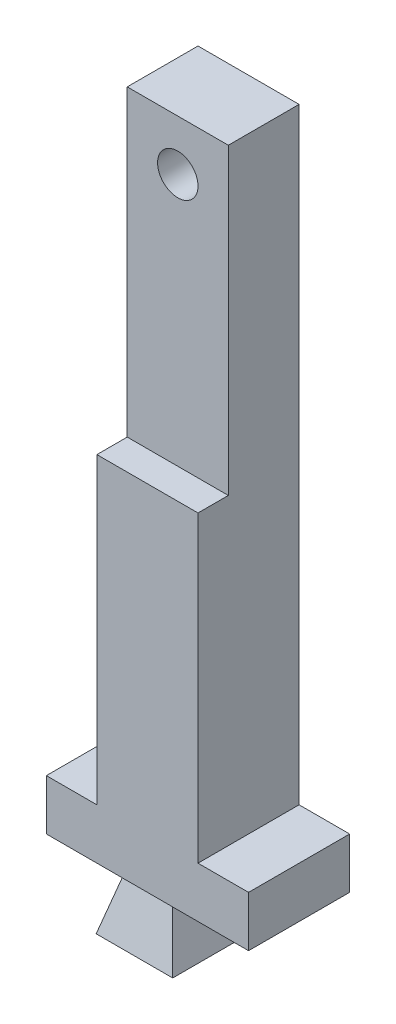
ISO-10303-21;
HEADER;
FILE_DESCRIPTION(('STEP AP214'),'2;1');
FILE_NAME('part.step','',(''),(''),'','','');
FILE_SCHEMA(('AUTOMOTIVE_DESIGN { 1 0 10303 214 1 1 1 1 }'));
ENDSEC;
DATA;
#1=APPLICATION_CONTEXT('core data for automotive mechanical design processes');
#2=APPLICATION_PROTOCOL_DEFINITION('international standard','automotive_design',2000,#1);
#3=PRODUCT_CONTEXT('',#1,'mechanical');
#4=PRODUCT('Part','Part','',(#3));
#5=PRODUCT_RELATED_PRODUCT_CATEGORY('part','',(#4));
#6=PRODUCT_DEFINITION_FORMATION('','',#4);
#7=PRODUCT_DEFINITION_CONTEXT('part definition',#1,'design');
#8=PRODUCT_DEFINITION('design','',#6,#7);
#9=PRODUCT_DEFINITION_SHAPE('','',#8);
#10=(LENGTH_UNIT() NAMED_UNIT(*) SI_UNIT(.MILLI.,.METRE.));
#11=(NAMED_UNIT(*) PLANE_ANGLE_UNIT() SI_UNIT($,.RADIAN.));
#12=(NAMED_UNIT(*) SI_UNIT($,.STERADIAN.) SOLID_ANGLE_UNIT());
#13=UNCERTAINTY_MEASURE_WITH_UNIT(LENGTH_MEASURE(1.E-05),#10,'distance_accuracy_value','');
#14=(GEOMETRIC_REPRESENTATION_CONTEXT(3) GLOBAL_UNCERTAINTY_ASSIGNED_CONTEXT((#13)) GLOBAL_UNIT_ASSIGNED_CONTEXT((#10,
#11,#12)) REPRESENTATION_CONTEXT('',''));
#15=CARTESIAN_POINT('',(0.,0.,0.));
#16=DIRECTION('',(0.,0.,1.));
#17=DIRECTION('',(1.,0.,0.));
#18=AXIS2_PLACEMENT_3D('',#15,#16,#17);
#19=CARTESIAN_POINT('',(0.,44.45,12.7));
#20=DIRECTION('',(0.,-1.,0.));
#21=DIRECTION('',(0.,0.,-1.));
#22=AXIS2_PLACEMENT_3D('',#19,#20,#21);
#23=PLANE('',#22);
#24=DIRECTION('',(1.,0.,0.));
#25=VECTOR('',#24,1.);
#26=CARTESIAN_POINT('',(0.,44.45,8.89));
#27=LINE('',#26,#25);
#28=CARTESIAN_POINT('',(0.,44.45,8.89));
#29=VERTEX_POINT('',#28);
#30=CARTESIAN_POINT('',(12.7,44.45,8.89));
#31=VERTEX_POINT('',#30);
#32=EDGE_CURVE('E150',#29,#31,#27,.T.);
#33=ORIENTED_EDGE('',*,*,#32,.F.);
#34=DIRECTION('',(0.,0.,-1.));
#35=VECTOR('',#34,1.);
#36=CARTESIAN_POINT('',(0.,44.45,12.7));
#37=LINE('',#36,#35);
#38=CARTESIAN_POINT('',(0.,44.45,12.7));
#39=VERTEX_POINT('',#38);
#40=EDGE_CURVE('E164',#39,#29,#37,.T.);
#41=ORIENTED_EDGE('',*,*,#40,.F.);
#42=DIRECTION('',(-1.,0.,0.));
#43=VECTOR('',#42,1.);
#44=CARTESIAN_POINT('',(0.,44.45,12.7));
#45=LINE('',#44,#43);
#46=CARTESIAN_POINT('',(12.7,44.45,12.7));
#47=VERTEX_POINT('',#46);
#48=EDGE_CURVE('E257',#47,#39,#45,.T.);
#49=ORIENTED_EDGE('',*,*,#48,.F.);
#50=DIRECTION('',(0.,0.,-1.));
#51=VECTOR('',#50,1.);
#52=CARTESIAN_POINT('',(12.7,44.45,12.7));
#53=LINE('',#52,#51);
#54=EDGE_CURVE('E167',#47,#31,#53,.T.);
#55=ORIENTED_EDGE('',*,*,#54,.T.);
#56=EDGE_LOOP('',(#33,#41,#49,#55));
#57=FACE_BOUND('',#56,.T.);
#58=ADVANCED_FACE('F43',(#57),#23,.F.);
#59=CARTESIAN_POINT('',(12.7,0.,12.7));
#60=DIRECTION('',(0.,1.,0.));
#61=DIRECTION('',(0.,0.,1.));
#62=AXIS2_PLACEMENT_3D('',#59,#60,#61);
#63=PLANE('',#62);
#64=DIRECTION('',(0.,0.,1.));
#65=VECTOR('',#64,1.);
#66=CARTESIAN_POINT('',(9.525,0.,0.));
#67=LINE('',#66,#65);
#68=CARTESIAN_POINT('',(9.525,0.,0.));
#69=VERTEX_POINT('',#68);
#70=CARTESIAN_POINT('',(9.525,0.,12.7));
#71=VERTEX_POINT('',#70);
#72=EDGE_CURVE('E296',#69,#71,#67,.T.);
#73=ORIENTED_EDGE('',*,*,#72,.F.);
#74=DIRECTION('',(1.,0.,0.));
#75=VECTOR('',#74,1.);
#76=CARTESIAN_POINT('',(12.7,0.,0.));
#77=LINE('',#76,#75);
#78=CARTESIAN_POINT('',(19.05,0.,0.));
#79=VERTEX_POINT('',#78);
#80=EDGE_CURVE('E246',#69,#79,#77,.T.);
#81=ORIENTED_EDGE('',*,*,#80,.T.);
#82=DIRECTION('',(0.,0.,-1.));
#83=VECTOR('',#82,1.);
#84=CARTESIAN_POINT('',(19.05,0.,12.7));
#85=LINE('',#84,#83);
#86=CARTESIAN_POINT('',(19.05,0.,12.7));
#87=VERTEX_POINT('',#86);
#88=EDGE_CURVE('E11',#87,#79,#85,.T.);
#89=ORIENTED_EDGE('',*,*,#88,.F.);
#90=DIRECTION('',(1.,0.,0.));
#91=VECTOR('',#90,1.);
#92=CARTESIAN_POINT('',(0.,0.,12.7));
#93=LINE('',#92,#91);
#94=EDGE_CURVE('E59',#71,#87,#93,.T.);
#95=ORIENTED_EDGE('',*,*,#94,.F.);
#96=EDGE_LOOP('',(#73,#81,#89,#95));
#97=FACE_BOUND('',#96,.T.);
#98=ADVANCED_FACE('F45',(#97),#63,.F.);
#99=DIRECTION('',(0.,0.,-1.));
#100=VECTOR('',#99,1.);
#101=CARTESIAN_POINT('',(3.175,0.,0.));
#102=LINE('',#101,#100);
#103=CARTESIAN_POINT('',(3.175,0.,12.7));
#104=VERTEX_POINT('',#103);
#105=CARTESIAN_POINT('',(3.175,0.,0.));
#106=VERTEX_POINT('',#105);
#107=EDGE_CURVE('E67',#104,#106,#102,.T.);
#108=ORIENTED_EDGE('',*,*,#107,.F.);
#109=CARTESIAN_POINT('',(-6.35,0.,12.7));
#110=VERTEX_POINT('',#109);
#111=EDGE_CURVE('E268',#110,#104,#93,.T.);
#112=ORIENTED_EDGE('',*,*,#111,.F.);
#113=DIRECTION('',(0.,0.,-1.));
#114=VECTOR('',#113,1.);
#115=CARTESIAN_POINT('',(-6.35,0.,12.7));
#116=LINE('',#115,#114);
#117=CARTESIAN_POINT('',(-6.35,0.,0.));
#118=VERTEX_POINT('',#117);
#119=EDGE_CURVE('E227',#110,#118,#116,.T.);
#120=ORIENTED_EDGE('',*,*,#119,.T.);
#121=EDGE_CURVE('E214',#118,#106,#77,.T.);
#122=ORIENTED_EDGE('',*,*,#121,.T.);
#123=EDGE_LOOP('',(#108,#112,#120,#122));
#124=FACE_BOUND('',#123,.T.);
#125=ADVANCED_FACE('F355',(#124),#63,.F.);
#126=CARTESIAN_POINT('',(19.05,0.,12.7));
#127=DIRECTION('',(-1.,0.,0.));
#128=DIRECTION('',(0.,0.,1.));
#129=AXIS2_PLACEMENT_3D('',#126,#127,#128);
#130=PLANE('',#129);
#131=DIRECTION('',(0.,1.,0.));
#132=VECTOR('',#131,1.);
#133=CARTESIAN_POINT('',(19.05,0.,0.));
#134=LINE('',#133,#132);
#135=CARTESIAN_POINT('',(19.05,6.35,0.));
#136=VERTEX_POINT('',#135);
#137=EDGE_CURVE('E205',#79,#136,#134,.T.);
#138=ORIENTED_EDGE('',*,*,#137,.T.);
#139=DIRECTION('',(0.,0.,-1.));
#140=VECTOR('',#139,1.);
#141=CARTESIAN_POINT('',(19.05,6.35,12.7));
#142=LINE('',#141,#140);
#143=CARTESIAN_POINT('',(19.05,6.35,12.7));
#144=VERTEX_POINT('',#143);
#145=EDGE_CURVE('E52',#144,#136,#142,.T.);
#146=ORIENTED_EDGE('',*,*,#145,.F.);
#147=DIRECTION('',(0.,1.,0.));
#148=VECTOR('',#147,1.);
#149=CARTESIAN_POINT('',(19.05,0.,12.7));
#150=LINE('',#149,#148);
#151=EDGE_CURVE('E265',#87,#144,#150,.T.);
#152=ORIENTED_EDGE('',*,*,#151,.F.);
#153=ORIENTED_EDGE('',*,*,#88,.T.);
#154=EDGE_LOOP('',(#138,#146,#152,#153));
#155=FACE_BOUND('',#154,.T.);
#156=ADVANCED_FACE('F364',(#155),#130,.F.);
#157=CARTESIAN_POINT('',(19.05,6.35,12.7));
#158=DIRECTION('',(0.,-1.,0.));
#159=DIRECTION('',(1.,0.,0.));
#160=AXIS2_PLACEMENT_3D('',#157,#158,#159);
#161=PLANE('',#160);
#162=DIRECTION('',(-1.,0.,0.));
#163=VECTOR('',#162,1.);
#164=CARTESIAN_POINT('',(19.05,6.35,0.));
#165=LINE('',#164,#163);
#166=CARTESIAN_POINT('',(12.7,6.35,0.));
#167=VERTEX_POINT('',#166);
#168=EDGE_CURVE('E196',#136,#167,#165,.T.);
#169=ORIENTED_EDGE('',*,*,#168,.T.);
#170=DIRECTION('',(0.,0.,-1.));
#171=VECTOR('',#170,1.);
#172=CARTESIAN_POINT('',(12.7,6.35,12.7));
#173=LINE('',#172,#171);
#174=CARTESIAN_POINT('',(12.7,6.35,12.7));
#175=VERTEX_POINT('',#174);
#176=EDGE_CURVE('E179',#175,#167,#173,.T.);
#177=ORIENTED_EDGE('',*,*,#176,.F.);
#178=DIRECTION('',(-1.,0.,0.));
#179=VECTOR('',#178,1.);
#180=CARTESIAN_POINT('',(19.05,6.35,12.7));
#181=LINE('',#180,#179);
#182=EDGE_CURVE('E197',#144,#175,#181,.T.);
#183=ORIENTED_EDGE('',*,*,#182,.F.);
#184=ORIENTED_EDGE('',*,*,#145,.T.);
#185=EDGE_LOOP('',(#169,#177,#183,#184));
#186=FACE_BOUND('',#185,.T.);
#187=ADVANCED_FACE('F194',(#186),#161,.F.);
#188=CARTESIAN_POINT('',(12.7,6.35,12.7));
#189=DIRECTION('',(-1.,0.,0.));
#190=DIRECTION('',(0.,0.,1.));
#191=AXIS2_PLACEMENT_3D('',#188,#189,#190);
#192=PLANE('',#191);
#193=DIRECTION('',(0.,1.,0.));
#194=VECTOR('',#193,1.);
#195=CARTESIAN_POINT('',(12.7,6.35,0.));
#196=LINE('',#195,#194);
#197=CARTESIAN_POINT('',(12.7,82.55,0.));
#198=VERTEX_POINT('',#197);
#199=EDGE_CURVE('E207',#167,#198,#196,.T.);
#200=ORIENTED_EDGE('',*,*,#199,.T.);
#201=DIRECTION('',(0.,0.,-1.));
#202=VECTOR('',#201,1.);
#203=CARTESIAN_POINT('',(12.7,82.55,0.));
#204=LINE('',#203,#202);
#205=CARTESIAN_POINT('',(12.7,82.55,8.89));
#206=VERTEX_POINT('',#205);
#207=EDGE_CURVE('E274',#206,#198,#204,.T.);
#208=ORIENTED_EDGE('',*,*,#207,.F.);
#209=DIRECTION('',(0.,1.,0.));
#210=VECTOR('',#209,1.);
#211=CARTESIAN_POINT('',(12.7,44.45,8.89));
#212=LINE('',#211,#210);
#213=EDGE_CURVE('E169',#31,#206,#212,.T.);
#214=ORIENTED_EDGE('',*,*,#213,.F.);
#215=ORIENTED_EDGE('',*,*,#54,.F.);
#216=DIRECTION('',(0.,1.,0.));
#217=VECTOR('',#216,1.);
#218=CARTESIAN_POINT('',(12.7,6.35,12.7));
#219=LINE('',#218,#217);
#220=EDGE_CURVE('E260',#175,#47,#219,.T.);
#221=ORIENTED_EDGE('',*,*,#220,.F.);
#222=ORIENTED_EDGE('',*,*,#176,.T.);
#223=EDGE_LOOP('',(#200,#208,#214,#215,#221,#222));
#224=FACE_BOUND('',#223,.T.);
#225=ADVANCED_FACE('F359',(#224),#192,.F.);
#226=CARTESIAN_POINT('',(0.,6.35,12.7));
#227=DIRECTION('',(1.,0.,0.));
#228=DIRECTION('',(0.,0.,-1.));
#229=AXIS2_PLACEMENT_3D('',#226,#227,#228);
#230=PLANE('',#229);
#231=DIRECTION('',(0.,-1.,0.));
#232=VECTOR('',#231,1.);
#233=CARTESIAN_POINT('',(0.,6.35,0.));
#234=LINE('',#233,#232);
#235=CARTESIAN_POINT('',(0.,82.55,0.));
#236=VERTEX_POINT('',#235);
#237=CARTESIAN_POINT('',(0.,6.35,0.));
#238=VERTEX_POINT('',#237);
#239=EDGE_CURVE('E212',#236,#238,#234,.T.);
#240=ORIENTED_EDGE('',*,*,#239,.T.);
#241=DIRECTION('',(0.,0.,-1.));
#242=VECTOR('',#241,1.);
#243=CARTESIAN_POINT('',(0.,6.35,12.7));
#244=LINE('',#243,#242);
#245=CARTESIAN_POINT('',(0.,6.35,12.7));
#246=VERTEX_POINT('',#245);
#247=EDGE_CURVE('E175',#246,#238,#244,.T.);
#248=ORIENTED_EDGE('',*,*,#247,.F.);
#249=DIRECTION('',(0.,-1.,0.));
#250=VECTOR('',#249,1.);
#251=CARTESIAN_POINT('',(0.,6.35,12.7));
#252=LINE('',#251,#250);
#253=EDGE_CURVE('E173',#39,#246,#252,.T.);
#254=ORIENTED_EDGE('',*,*,#253,.F.);
#255=ORIENTED_EDGE('',*,*,#40,.T.);
#256=DIRECTION('',(0.,-1.,0.));
#257=VECTOR('',#256,1.);
#258=CARTESIAN_POINT('',(0.,44.45,8.89));
#259=LINE('',#258,#257);
#260=CARTESIAN_POINT('',(0.,82.55,8.89));
#261=VERTEX_POINT('',#260);
#262=EDGE_CURVE('E146',#261,#29,#259,.T.);
#263=ORIENTED_EDGE('',*,*,#262,.F.);
#264=DIRECTION('',(0.,0.,1.));
#265=VECTOR('',#264,1.);
#266=CARTESIAN_POINT('',(0.,82.55,0.));
#267=LINE('',#266,#265);
#268=EDGE_CURVE('E278',#236,#261,#267,.T.);
#269=ORIENTED_EDGE('',*,*,#268,.F.);
#270=EDGE_LOOP('',(#240,#248,#254,#255,#263,#269));
#271=FACE_BOUND('',#270,.T.);
#272=ADVANCED_FACE('F171',(#271),#230,.F.);
#273=CARTESIAN_POINT('',(-6.35,6.35,12.7));
#274=DIRECTION('',(0.,-1.,0.));
#275=DIRECTION('',(0.,0.,-1.));
#276=AXIS2_PLACEMENT_3D('',#273,#274,#275);
#277=PLANE('',#276);
#278=DIRECTION('',(-1.,0.,0.));
#279=VECTOR('',#278,1.);
#280=CARTESIAN_POINT('',(-6.35,6.35,0.));
#281=LINE('',#280,#279);
#282=CARTESIAN_POINT('',(-6.35,6.35,0.));
#283=VERTEX_POINT('',#282);
#284=EDGE_CURVE('E220',#238,#283,#281,.T.);
#285=ORIENTED_EDGE('',*,*,#284,.T.);
#286=DIRECTION('',(0.,0.,-1.));
#287=VECTOR('',#286,1.);
#288=CARTESIAN_POINT('',(-6.35,6.35,12.7));
#289=LINE('',#288,#287);
#290=CARTESIAN_POINT('',(-6.35,6.35,12.7));
#291=VERTEX_POINT('',#290);
#292=EDGE_CURVE('E182',#291,#283,#289,.T.);
#293=ORIENTED_EDGE('',*,*,#292,.F.);
#294=DIRECTION('',(-1.,0.,0.));
#295=VECTOR('',#294,1.);
#296=CARTESIAN_POINT('',(-6.35,6.35,12.7));
#297=LINE('',#296,#295);
#298=EDGE_CURVE('E252',#246,#291,#297,.T.);
#299=ORIENTED_EDGE('',*,*,#298,.F.);
#300=ORIENTED_EDGE('',*,*,#247,.T.);
#301=EDGE_LOOP('',(#285,#293,#299,#300));
#302=FACE_BOUND('',#301,.T.);
#303=ADVANCED_FACE('F385',(#302),#277,.F.);
#304=CARTESIAN_POINT('',(-6.35,0.,12.7));
#305=DIRECTION('',(1.,0.,0.));
#306=DIRECTION('',(0.,0.,-1.));
#307=AXIS2_PLACEMENT_3D('',#304,#305,#306);
#308=PLANE('',#307);
#309=DIRECTION('',(0.,-1.,0.));
#310=VECTOR('',#309,1.);
#311=CARTESIAN_POINT('',(-6.35,0.,0.));
#312=LINE('',#311,#310);
#313=EDGE_CURVE('E223',#283,#118,#312,.T.);
#314=ORIENTED_EDGE('',*,*,#313,.T.);
#315=ORIENTED_EDGE('',*,*,#119,.F.);
#316=DIRECTION('',(0.,-1.,0.));
#317=VECTOR('',#316,1.);
#318=CARTESIAN_POINT('',(-6.35,0.,12.7));
#319=LINE('',#318,#317);
#320=EDGE_CURVE('E230',#291,#110,#319,.T.);
#321=ORIENTED_EDGE('',*,*,#320,.F.);
#322=ORIENTED_EDGE('',*,*,#292,.T.);
#323=EDGE_LOOP('',(#314,#315,#321,#322));
#324=FACE_BOUND('',#323,.T.);
#325=ADVANCED_FACE('F237',(#324),#308,.F.);
#326=CARTESIAN_POINT('',(0.,0.,12.7));
#327=DIRECTION('',(0.,0.,-1.));
#328=DIRECTION('',(-1.,0.,0.));
#329=AXIS2_PLACEMENT_3D('',#326,#327,#328);
#330=PLANE('',#329);
#331=ORIENTED_EDGE('',*,*,#111,.T.);
#332=DIRECTION('',(-1.,0.,0.));
#333=VECTOR('',#332,1.);
#334=CARTESIAN_POINT('',(3.175,0.,12.7));
#335=LINE('',#334,#333);
#336=EDGE_CURVE('E318',#71,#104,#335,.T.);
#337=ORIENTED_EDGE('',*,*,#336,.F.);
#338=ORIENTED_EDGE('',*,*,#94,.T.);
#339=ORIENTED_EDGE('',*,*,#151,.T.);
#340=ORIENTED_EDGE('',*,*,#182,.T.);
#341=ORIENTED_EDGE('',*,*,#220,.T.);
#342=ORIENTED_EDGE('',*,*,#48,.T.);
#343=ORIENTED_EDGE('',*,*,#253,.T.);
#344=ORIENTED_EDGE('',*,*,#298,.T.);
#345=ORIENTED_EDGE('',*,*,#320,.T.);
#346=EDGE_LOOP('',(#331,#337,#338,#339,#340,#341,#342,#343,#344,#345));
#347=FACE_BOUND('',#346,.T.);
#348=ADVANCED_FACE('F384',(#347),#330,.F.);
#349=CARTESIAN_POINT('',(0.,0.,0.));
#350=DIRECTION('',(0.,0.,-1.));
#351=DIRECTION('',(-1.,0.,0.));
#352=AXIS2_PLACEMENT_3D('',#349,#350,#351);
#353=PLANE('',#352);
#354=CARTESIAN_POINT('',(6.35,76.2,0.));
#355=DIRECTION('',(0.,0.,1.));
#356=DIRECTION('',(1.,0.,0.));
#357=AXIS2_PLACEMENT_3D('',#354,#355,#356);
#358=CIRCLE('',#357,2.54);
#359=CARTESIAN_POINT('',(8.89,76.2,0.));
#360=VERTEX_POINT('',#359);
#361=EDGE_CURVE('E158',#360,#360,#358,.T.);
#362=ORIENTED_EDGE('',*,*,#361,.T.);
#363=EDGE_LOOP('',(#362));
#364=FACE_BOUND('',#363,.T.);
#365=ORIENTED_EDGE('',*,*,#121,.F.);
#366=ORIENTED_EDGE('',*,*,#313,.F.);
#367=ORIENTED_EDGE('',*,*,#284,.F.);
#368=ORIENTED_EDGE('',*,*,#239,.F.);
#369=DIRECTION('',(-1.,0.,0.));
#370=VECTOR('',#369,1.);
#371=CARTESIAN_POINT('',(0.,82.55,0.));
#372=LINE('',#371,#370);
#373=EDGE_CURVE('E248',#198,#236,#372,.T.);
#374=ORIENTED_EDGE('',*,*,#373,.F.);
#375=ORIENTED_EDGE('',*,*,#199,.F.);
#376=ORIENTED_EDGE('',*,*,#168,.F.);
#377=ORIENTED_EDGE('',*,*,#137,.F.);
#378=ORIENTED_EDGE('',*,*,#80,.F.);
#379=DIRECTION('',(1.,0.,0.));
#380=VECTOR('',#379,1.);
#381=CARTESIAN_POINT('',(9.525,0.,0.));
#382=LINE('',#381,#380);
#383=EDGE_CURVE('E244',#106,#69,#382,.T.);
#384=ORIENTED_EDGE('',*,*,#383,.F.);
#385=EDGE_LOOP('',(#365,#366,#367,#368,#374,#375,#376,#377,#378,#384));
#386=FACE_BOUND('',#385,.T.);
#387=ADVANCED_FACE('F203',(#364,#386),#353,.T.);
#388=CARTESIAN_POINT('',(0.,82.55,0.));
#389=DIRECTION('',(0.,1.,0.));
#390=DIRECTION('',(0.,0.,1.));
#391=AXIS2_PLACEMENT_3D('',#388,#389,#390);
#392=PLANE('',#391);
#393=ORIENTED_EDGE('',*,*,#268,.T.);
#394=DIRECTION('',(-1.,0.,0.));
#395=VECTOR('',#394,1.);
#396=CARTESIAN_POINT('',(0.,82.55,8.89));
#397=LINE('',#396,#395);
#398=EDGE_CURVE('E153',#206,#261,#397,.T.);
#399=ORIENTED_EDGE('',*,*,#398,.F.);
#400=ORIENTED_EDGE('',*,*,#207,.T.);
#401=ORIENTED_EDGE('',*,*,#373,.T.);
#402=EDGE_LOOP('',(#393,#399,#400,#401));
#403=FACE_BOUND('',#402,.T.);
#404=ADVANCED_FACE('F387',(#403),#392,.T.);
#405=CARTESIAN_POINT('',(3.175,0.,12.7));
#406=DIRECTION('',(0.,0.258819045102521,0.965925826289068));
#407=DIRECTION('',(0.,-0.965925826289068,0.258819045102521));
#408=AXIS2_PLACEMENT_3D('',#405,#406,#407);
#409=PLANE('',#408);
#410=ORIENTED_EDGE('',*,*,#336,.T.);
#411=DIRECTION('',(0.250562807085732,0.935113126531029,-0.250562807085732));
#412=VECTOR('',#411,1.);
#413=CARTESIAN_POINT('',(3.97232784774246,2.97566803806439,11.9026721522575));
#414=LINE('',#413,#412);
#415=CARTESIAN_POINT('',(1.54158172293987,-6.096,14.3334182770601));
#416=VERTEX_POINT('',#415);
#417=EDGE_CURVE('E281',#416,#104,#414,.T.);
#418=ORIENTED_EDGE('',*,*,#417,.F.);
#419=DIRECTION('',(1.,0.,0.));
#420=VECTOR('',#419,1.);
#421=CARTESIAN_POINT('',(3.175,-6.096,14.3334182770601));
#422=LINE('',#421,#420);
#423=CARTESIAN_POINT('',(11.1584182770601,-6.096,14.3334182770601));
#424=VERTEX_POINT('',#423);
#425=EDGE_CURVE('E292',#424,#416,#422,.F.);
#426=ORIENTED_EDGE('',*,*,#425,.F.);
#427=DIRECTION('',(-0.250562807085732,0.935113126531029,-0.250562807085732));
#428=VECTOR('',#427,1.);
#429=CARTESIAN_POINT('',(9.12633607612877,1.4878340190322,12.3013360761288));
#430=LINE('',#429,#428);
#431=EDGE_CURVE('E285',#424,#71,#430,.T.);
#432=ORIENTED_EDGE('',*,*,#431,.T.);
#433=EDGE_LOOP('',(#410,#418,#426,#432));
#434=FACE_BOUND('',#433,.T.);
#435=ADVANCED_FACE('F382',(#434),#409,.T.);
#436=CARTESIAN_POINT('',(3.175,0.,0.));
#437=DIRECTION('',(-0.965925826289068,0.258819045102521,0.));
#438=DIRECTION('',(-0.258819045102521,-0.965925826289068,0.));
#439=AXIS2_PLACEMENT_3D('',#436,#437,#438);
#440=PLANE('',#439);
#441=ORIENTED_EDGE('',*,*,#107,.T.);
#442=DIRECTION('',(0.250562807085732,0.935113126531029,0.250562807085732));
#443=VECTOR('',#442,1.);
#444=CARTESIAN_POINT('',(3.57366392387123,1.4878340190322,0.398663923871229));
#445=LINE('',#444,#443);
#446=CARTESIAN_POINT('',(1.54158172293987,-6.096,-1.63341827706013));
#447=VERTEX_POINT('',#446);
#448=EDGE_CURVE('E297',#447,#106,#445,.T.);
#449=ORIENTED_EDGE('',*,*,#448,.F.);
#450=DIRECTION('',(0.,0.,1.));
#451=VECTOR('',#450,1.);
#452=CARTESIAN_POINT('',(1.54158172293987,-6.096,0.));
#453=LINE('',#452,#451);
#454=EDGE_CURVE('E289',#416,#447,#453,.F.);
#455=ORIENTED_EDGE('',*,*,#454,.F.);
#456=ORIENTED_EDGE('',*,*,#417,.T.);
#457=EDGE_LOOP('',(#441,#449,#455,#456));
#458=FACE_BOUND('',#457,.T.);
#459=ADVANCED_FACE('F380',(#458),#440,.T.);
#460=CARTESIAN_POINT('',(9.525,0.,0.));
#461=DIRECTION('',(0.,0.258819045102521,-0.965925826289068));
#462=DIRECTION('',(0.,0.965925826289068,0.258819045102521));
#463=AXIS2_PLACEMENT_3D('',#460,#461,#462);
#464=PLANE('',#463);
#465=ORIENTED_EDGE('',*,*,#383,.T.);
#466=DIRECTION('',(-0.250562807085732,0.935113126531029,0.250562807085732));
#467=VECTOR('',#466,1.);
#468=CARTESIAN_POINT('',(9.525,0.,0.));
#469=LINE('',#468,#467);
#470=CARTESIAN_POINT('',(11.1584182770601,-6.096,-1.63341827706013));
#471=VERTEX_POINT('',#470);
#472=EDGE_CURVE('E301',#471,#69,#469,.T.);
#473=ORIENTED_EDGE('',*,*,#472,.F.);
#474=DIRECTION('',(-1.,0.,0.));
#475=VECTOR('',#474,1.);
#476=CARTESIAN_POINT('',(9.525,-6.096,-1.63341827706013));
#477=LINE('',#476,#475);
#478=EDGE_CURVE('E286',#447,#471,#477,.F.);
#479=ORIENTED_EDGE('',*,*,#478,.F.);
#480=ORIENTED_EDGE('',*,*,#448,.T.);
#481=EDGE_LOOP('',(#465,#473,#479,#480));
#482=FACE_BOUND('',#481,.T.);
#483=ADVANCED_FACE('F371',(#482),#464,.T.);
#484=CARTESIAN_POINT('',(9.525,0.,0.));
#485=DIRECTION('',(0.965925826289068,0.258819045102521,0.));
#486=DIRECTION('',(-0.258819045102521,0.965925826289068,0.));
#487=AXIS2_PLACEMENT_3D('',#484,#485,#486);
#488=PLANE('',#487);
#489=ORIENTED_EDGE('',*,*,#72,.T.);
#490=ORIENTED_EDGE('',*,*,#431,.F.);
#491=DIRECTION('',(0.,0.,-1.));
#492=VECTOR('',#491,1.);
#493=CARTESIAN_POINT('',(11.1584182770601,-6.096,0.));
#494=LINE('',#493,#492);
#495=EDGE_CURVE('E282',#471,#424,#494,.F.);
#496=ORIENTED_EDGE('',*,*,#495,.F.);
#497=ORIENTED_EDGE('',*,*,#472,.T.);
#498=EDGE_LOOP('',(#489,#490,#496,#497));
#499=FACE_BOUND('',#498,.T.);
#500=ADVANCED_FACE('F347',(#499),#488,.T.);
#501=CARTESIAN_POINT('',(0.,-6.096,0.));
#502=DIRECTION('',(0.,-1.,0.));
#503=DIRECTION('',(0.,0.,-1.));
#504=AXIS2_PLACEMENT_3D('',#501,#502,#503);
#505=PLANE('',#504);
#506=ORIENTED_EDGE('',*,*,#425,.T.);
#507=ORIENTED_EDGE('',*,*,#454,.T.);
#508=ORIENTED_EDGE('',*,*,#478,.T.);
#509=ORIENTED_EDGE('',*,*,#495,.T.);
#510=EDGE_LOOP('',(#506,#507,#508,#509));
#511=FACE_BOUND('',#510,.T.);
#512=ADVANCED_FACE('F342',(#511),#505,.T.);
#513=CARTESIAN_POINT('',(0.,0.,8.89));
#514=DIRECTION('',(0.,0.,-1.));
#515=DIRECTION('',(-1.,0.,0.));
#516=AXIS2_PLACEMENT_3D('',#513,#514,#515);
#517=PLANE('',#516);
#518=CARTESIAN_POINT('',(6.35,76.2,8.89));
#519=DIRECTION('',(0.,0.,1.));
#520=DIRECTION('',(1.,0.,0.));
#521=AXIS2_PLACEMENT_3D('',#518,#519,#520);
#522=CIRCLE('',#521,2.54);
#523=CARTESIAN_POINT('',(8.89,76.2,8.89));
#524=VERTEX_POINT('',#523);
#525=EDGE_CURVE('E326',#524,#524,#522,.T.);
#526=ORIENTED_EDGE('',*,*,#525,.F.);
#527=EDGE_LOOP('',(#526));
#528=FACE_BOUND('',#527,.T.);
#529=ORIENTED_EDGE('',*,*,#262,.T.);
#530=ORIENTED_EDGE('',*,*,#32,.T.);
#531=ORIENTED_EDGE('',*,*,#213,.T.);
#532=ORIENTED_EDGE('',*,*,#398,.T.);
#533=EDGE_LOOP('',(#529,#530,#531,#532));
#534=FACE_BOUND('',#533,.T.);
#535=ADVANCED_FACE('F148',(#528,#534),#517,.F.);
#536=CARTESIAN_POINT('',(6.35,76.2,0.));
#537=DIRECTION('',(0.,0.,1.));
#538=DIRECTION('',(1.,0.,0.));
#539=AXIS2_PLACEMENT_3D('',#536,#537,#538);
#540=CYLINDRICAL_SURFACE('',#539,2.54);
#541=ORIENTED_EDGE('',*,*,#361,.F.);
#542=EDGE_LOOP('',(#541));
#543=FACE_BOUND('',#542,.T.);
#544=ORIENTED_EDGE('',*,*,#525,.T.);
#545=EDGE_LOOP('',(#544));
#546=FACE_BOUND('',#545,.T.);
#547=ADVANCED_FACE('F335',(#543,#546),#540,.F.);
#548=CLOSED_SHELL('',(#58,#98,#125,#156,#187,#225,#272,#303,#325,#348,#387,#404,#435,#459,#483,
#500,#512,#535,#547));
#549=MANIFOLD_SOLID_BREP('B2',#548);
#550=ADVANCED_BREP_SHAPE_REPRESENTATION('',(#18,#549),#14);
#551=SHAPE_DEFINITION_REPRESENTATION(#9,#550);
ENDSEC;
END-ISO-10303-21;
